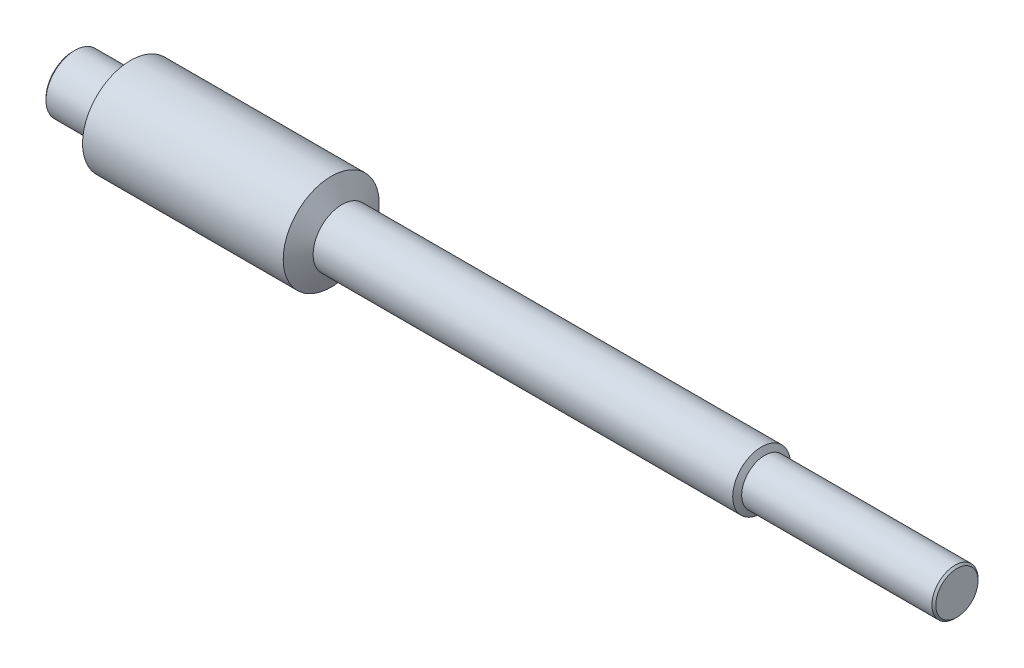
ISO-10303-21;
HEADER;
FILE_DESCRIPTION(('STEP AP214'),'2;1');
FILE_NAME('part.step','',(''),(''),'','','');
FILE_SCHEMA(('AUTOMOTIVE_DESIGN { 1 0 10303 214 1 1 1 1 }'));
ENDSEC;
DATA;
#1=APPLICATION_CONTEXT('core data for automotive mechanical design processes');
#2=APPLICATION_PROTOCOL_DEFINITION('international standard','automotive_design',2000,#1);
#3=PRODUCT_CONTEXT('',#1,'mechanical');
#4=PRODUCT('Part','Part','',(#3));
#5=PRODUCT_RELATED_PRODUCT_CATEGORY('part','',(#4));
#6=PRODUCT_DEFINITION_FORMATION('','',#4);
#7=PRODUCT_DEFINITION_CONTEXT('part definition',#1,'design');
#8=PRODUCT_DEFINITION('design','',#6,#7);
#9=PRODUCT_DEFINITION_SHAPE('','',#8);
#10=(LENGTH_UNIT() NAMED_UNIT(*) SI_UNIT(.MILLI.,.METRE.));
#11=(NAMED_UNIT(*) PLANE_ANGLE_UNIT() SI_UNIT($,.RADIAN.));
#12=(NAMED_UNIT(*) SI_UNIT($,.STERADIAN.) SOLID_ANGLE_UNIT());
#13=UNCERTAINTY_MEASURE_WITH_UNIT(LENGTH_MEASURE(1.E-05),#10,'distance_accuracy_value','');
#14=(GEOMETRIC_REPRESENTATION_CONTEXT(3) GLOBAL_UNCERTAINTY_ASSIGNED_CONTEXT((#13)) GLOBAL_UNIT_ASSIGNED_CONTEXT((#10,
#11,#12)) REPRESENTATION_CONTEXT('',''));
#15=CARTESIAN_POINT('',(0.,0.,0.));
#16=DIRECTION('',(0.,0.,1.));
#17=DIRECTION('',(1.,0.,0.));
#18=AXIS2_PLACEMENT_3D('',#15,#16,#17);
#19=CARTESIAN_POINT('',(-133.522258266138,0.,0.));
#20=DIRECTION('',(1.,0.,0.));
#21=DIRECTION('',(0.,0.,-1.));
#22=AXIS2_PLACEMENT_3D('',#19,#20,#21);
#23=PLANE('',#22);
#24=CARTESIAN_POINT('',(-133.522258266138,0.,0.));
#25=DIRECTION('',(1.,0.,0.));
#26=DIRECTION('',(0.,0.,-1.));
#27=AXIS2_PLACEMENT_3D('',#24,#25,#26);
#28=CIRCLE('',#27,14.);
#29=CARTESIAN_POINT('',(-133.522258266138,0.,-14.));
#30=VERTEX_POINT('',#29);
#31=EDGE_CURVE('E84',#30,#30,#28,.F.);
#32=ORIENTED_EDGE('',*,*,#31,.T.);
#33=EDGE_LOOP('',(#32));
#34=FACE_BOUND('',#33,.T.);
#35=CARTESIAN_POINT('',(-133.522258266138,0.,0.));
#36=DIRECTION('',(-1.,0.,0.));
#37=DIRECTION('',(0.,0.,1.));
#38=AXIS2_PLACEMENT_3D('',#35,#36,#37);
#39=CIRCLE('',#38,3.4);
#40=CARTESIAN_POINT('',(-133.522258266138,0.,3.4));
#41=VERTEX_POINT('',#40);
#42=EDGE_CURVE('E56',#41,#41,#39,.T.);
#43=ORIENTED_EDGE('',*,*,#42,.F.);
#44=EDGE_LOOP('',(#43));
#45=FACE_BOUND('',#44,.T.);
#46=ADVANCED_FACE('F35',(#34,#45),#23,.F.);
#47=CARTESIAN_POINT('',(-73.1788372135069,0.,0.));
#48=DIRECTION('',(-1.,0.,0.));
#49=DIRECTION('',(0.,0.,1.));
#50=AXIS2_PLACEMENT_3D('',#47,#48,#49);
#51=CYLINDRICAL_SURFACE('',#50,15.);
#52=CARTESIAN_POINT('',(-132.522258266138,0.,0.));
#53=DIRECTION('',(1.,0.,0.));
#54=DIRECTION('',(0.,0.,-1.));
#55=AXIS2_PLACEMENT_3D('',#52,#53,#54);
#56=CIRCLE('',#55,15.);
#57=CARTESIAN_POINT('',(-132.522258266138,0.,-15.));
#58=VERTEX_POINT('',#57);
#59=EDGE_CURVE('E87',#58,#58,#56,.T.);
#60=ORIENTED_EDGE('',*,*,#59,.T.);
#61=EDGE_LOOP('',(#60));
#62=FACE_BOUND('',#61,.T.);
#63=CARTESIAN_POINT('',(-106.522258266138,0.,0.));
#64=DIRECTION('',(-1.,0.,0.));
#65=DIRECTION('',(0.,0.,1.));
#66=AXIS2_PLACEMENT_3D('',#63,#64,#65);
#67=CIRCLE('',#66,15.);
#68=CARTESIAN_POINT('',(-106.522258266138,0.,15.));
#69=VERTEX_POINT('',#68);
#70=EDGE_CURVE('E81',#69,#69,#67,.T.);
#71=ORIENTED_EDGE('',*,*,#70,.T.);
#72=EDGE_LOOP('',(#71));
#73=FACE_BOUND('',#72,.T.);
#74=ADVANCED_FACE('F104',(#62,#73),#51,.T.);
#75=CARTESIAN_POINT('',(-106.522258266138,15.,0.));
#76=DIRECTION('',(-1.,0.,0.));
#77=DIRECTION('',(0.,0.,1.));
#78=AXIS2_PLACEMENT_3D('',#75,#76,#77);
#79=PLANE('',#78);
#80=ORIENTED_EDGE('',*,*,#70,.F.);
#81=EDGE_LOOP('',(#80));
#82=FACE_BOUND('',#81,.T.);
#83=CARTESIAN_POINT('',(-106.522258266138,0.,0.));
#84=DIRECTION('',(-1.,0.,0.));
#85=DIRECTION('',(0.,0.,1.));
#86=AXIS2_PLACEMENT_3D('',#83,#84,#85);
#87=CIRCLE('',#86,14.);
#88=CARTESIAN_POINT('',(-106.522258266138,0.,14.));
#89=VERTEX_POINT('',#88);
#90=EDGE_CURVE('E78',#89,#89,#87,.T.);
#91=ORIENTED_EDGE('',*,*,#90,.T.);
#92=EDGE_LOOP('',(#91));
#93=FACE_BOUND('',#92,.T.);
#94=ADVANCED_FACE('F110',(#82,#93),#79,.F.);
#95=CARTESIAN_POINT('',(-73.1788372135069,0.,0.));
#96=DIRECTION('',(-1.,0.,0.));
#97=DIRECTION('',(0.,0.,1.));
#98=AXIS2_PLACEMENT_3D('',#95,#96,#97);
#99=CYLINDRICAL_SURFACE('',#98,14.);
#100=ORIENTED_EDGE('',*,*,#90,.F.);
#101=EDGE_LOOP('',(#100));
#102=FACE_BOUND('',#101,.T.);
#103=CARTESIAN_POINT('',(-103.522258266138,0.,0.));
#104=DIRECTION('',(-1.,0.,0.));
#105=DIRECTION('',(0.,0.,1.));
#106=AXIS2_PLACEMENT_3D('',#103,#104,#105);
#107=CIRCLE('',#106,14.);
#108=CARTESIAN_POINT('',(-103.522258266138,0.,14.));
#109=VERTEX_POINT('',#108);
#110=EDGE_CURVE('E75',#109,#109,#107,.T.);
#111=ORIENTED_EDGE('',*,*,#110,.T.);
#112=EDGE_LOOP('',(#111));
#113=FACE_BOUND('',#112,.T.);
#114=ADVANCED_FACE('F117',(#102,#113),#99,.T.);
#115=CARTESIAN_POINT('',(-103.522258266138,14.,0.));
#116=DIRECTION('',(1.,0.,0.));
#117=DIRECTION('',(0.,0.,-1.));
#118=AXIS2_PLACEMENT_3D('',#115,#116,#117);
#119=PLANE('',#118);
#120=ORIENTED_EDGE('',*,*,#110,.F.);
#121=EDGE_LOOP('',(#120));
#122=FACE_BOUND('',#121,.T.);
#123=CARTESIAN_POINT('',(-103.522258266138,0.,0.));
#124=DIRECTION('',(-1.,0.,0.));
#125=DIRECTION('',(0.,0.,1.));
#126=AXIS2_PLACEMENT_3D('',#123,#124,#125);
#127=CIRCLE('',#126,25.);
#128=CARTESIAN_POINT('',(-103.522258266138,0.,25.));
#129=VERTEX_POINT('',#128);
#130=EDGE_CURVE('E72',#129,#129,#127,.T.);
#131=ORIENTED_EDGE('',*,*,#130,.T.);
#132=EDGE_LOOP('',(#131));
#133=FACE_BOUND('',#132,.T.);
#134=ADVANCED_FACE('F121',(#122,#133),#119,.F.);
#135=CARTESIAN_POINT('',(-73.1788372135069,0.,0.));
#136=DIRECTION('',(-1.,0.,0.));
#137=DIRECTION('',(0.,0.,1.));
#138=AXIS2_PLACEMENT_3D('',#135,#136,#137);
#139=CYLINDRICAL_SURFACE('',#138,25.);
#140=ORIENTED_EDGE('',*,*,#130,.F.);
#141=EDGE_LOOP('',(#140));
#142=FACE_BOUND('',#141,.T.);
#143=CARTESIAN_POINT('',(0.919675372305515,0.,0.));
#144=DIRECTION('',(-1.,0.,0.));
#145=DIRECTION('',(0.,0.,1.));
#146=AXIS2_PLACEMENT_3D('',#143,#144,#145);
#147=CIRCLE('',#146,25.);
#148=CARTESIAN_POINT('',(0.919675372305515,0.,25.));
#149=VERTEX_POINT('',#148);
#150=EDGE_CURVE('E69',#149,#149,#147,.T.);
#151=ORIENTED_EDGE('',*,*,#150,.T.);
#152=EDGE_LOOP('',(#151));
#153=FACE_BOUND('',#152,.T.);
#154=ADVANCED_FACE('F125',(#142,#153),#139,.T.);
#155=CARTESIAN_POINT('',(6.47774173386165,0.,0.));
#156=DIRECTION('',(-1.,0.,0.));
#157=DIRECTION('',(0.,0.,1.));
#158=AXIS2_PLACEMENT_3D('',#155,#156,#157);
#159=CONICAL_SURFACE('',#158,15.,1.06350597937622);
#160=ORIENTED_EDGE('',*,*,#150,.F.);
#161=EDGE_LOOP('',(#160));
#162=FACE_BOUND('',#161,.T.);
#163=CARTESIAN_POINT('',(6.47774173386165,0.,0.));
#164=DIRECTION('',(-1.,0.,0.));
#165=DIRECTION('',(0.,0.,1.));
#166=AXIS2_PLACEMENT_3D('',#163,#164,#165);
#167=CIRCLE('',#166,15.);
#168=CARTESIAN_POINT('',(6.47774173386165,0.,15.));
#169=VERTEX_POINT('',#168);
#170=EDGE_CURVE('E66',#169,#169,#167,.T.);
#171=ORIENTED_EDGE('',*,*,#170,.T.);
#172=EDGE_LOOP('',(#171));
#173=FACE_BOUND('',#172,.T.);
#174=ADVANCED_FACE('F129',(#162,#173),#159,.T.);
#175=CARTESIAN_POINT('',(-73.1788372135069,0.,0.));
#176=DIRECTION('',(-1.,0.,0.));
#177=DIRECTION('',(0.,0.,1.));
#178=AXIS2_PLACEMENT_3D('',#175,#176,#177);
#179=CYLINDRICAL_SURFACE('',#178,15.);
#180=ORIENTED_EDGE('',*,*,#170,.F.);
#181=EDGE_LOOP('',(#180));
#182=FACE_BOUND('',#181,.T.);
#183=CARTESIAN_POINT('',(224.810321825395,0.,0.));
#184=DIRECTION('',(-1.,0.,0.));
#185=DIRECTION('',(0.,0.,1.));
#186=AXIS2_PLACEMENT_3D('',#183,#184,#185);
#187=CIRCLE('',#186,15.);
#188=CARTESIAN_POINT('',(224.810321825395,0.,15.));
#189=VERTEX_POINT('',#188);
#190=EDGE_CURVE('E59',#189,#189,#187,.T.);
#191=ORIENTED_EDGE('',*,*,#190,.T.);
#192=EDGE_LOOP('',(#191));
#193=FACE_BOUND('',#192,.T.);
#194=ADVANCED_FACE('F133',(#182,#193),#179,.T.);
#195=CARTESIAN_POINT('',(226.477741733862,0.,0.));
#196=DIRECTION('',(-1.,0.,0.));
#197=DIRECTION('',(0.,0.,1.));
#198=AXIS2_PLACEMENT_3D('',#195,#196,#197);
#199=CONICAL_SURFACE('',#198,12.,1.06350597937623);
#200=ORIENTED_EDGE('',*,*,#190,.F.);
#201=EDGE_LOOP('',(#200));
#202=FACE_BOUND('',#201,.T.);
#203=CARTESIAN_POINT('',(226.477741733862,0.,0.));
#204=DIRECTION('',(-1.,0.,0.));
#205=DIRECTION('',(0.,0.,1.));
#206=AXIS2_PLACEMENT_3D('',#203,#204,#205);
#207=CIRCLE('',#206,12.);
#208=CARTESIAN_POINT('',(226.477741733862,0.,12.));
#209=VERTEX_POINT('',#208);
#210=EDGE_CURVE('E55',#209,#209,#207,.T.);
#211=ORIENTED_EDGE('',*,*,#210,.T.);
#212=EDGE_LOOP('',(#211));
#213=FACE_BOUND('',#212,.T.);
#214=ADVANCED_FACE('F137',(#202,#213),#199,.T.);
#215=CARTESIAN_POINT('',(-73.1788372135069,0.,0.));
#216=DIRECTION('',(-1.,0.,0.));
#217=DIRECTION('',(0.,0.,1.));
#218=AXIS2_PLACEMENT_3D('',#215,#216,#217);
#219=CYLINDRICAL_SURFACE('',#218,12.);
#220=CARTESIAN_POINT('',(325.477741733862,0.,0.));
#221=DIRECTION('',(-1.,0.,0.));
#222=DIRECTION('',(0.,0.,1.));
#223=AXIS2_PLACEMENT_3D('',#220,#221,#222);
#224=CIRCLE('',#223,12.);
#225=CARTESIAN_POINT('',(325.477741733862,0.,12.));
#226=VERTEX_POINT('',#225);
#227=EDGE_CURVE('E42',#226,#226,#224,.T.);
#228=ORIENTED_EDGE('',*,*,#227,.T.);
#229=EDGE_LOOP('',(#228));
#230=FACE_BOUND('',#229,.T.);
#231=ORIENTED_EDGE('',*,*,#210,.F.);
#232=EDGE_LOOP('',(#231));
#233=FACE_BOUND('',#232,.T.);
#234=ADVANCED_FACE('F92',(#230,#233),#219,.T.);
#235=CARTESIAN_POINT('',(326.477741733862,12.,0.));
#236=DIRECTION('',(-1.,0.,0.));
#237=DIRECTION('',(0.,0.,1.));
#238=AXIS2_PLACEMENT_3D('',#235,#236,#237);
#239=PLANE('',#238);
#240=CARTESIAN_POINT('',(326.477741733862,0.,0.));
#241=DIRECTION('',(-1.,0.,0.));
#242=DIRECTION('',(0.,0.,1.));
#243=AXIS2_PLACEMENT_3D('',#240,#241,#242);
#244=CIRCLE('',#243,11.0000000000002);
#245=CARTESIAN_POINT('',(326.477741733862,0.,11.0000000000002));
#246=VERTEX_POINT('',#245);
#247=EDGE_CURVE('E11',#246,#246,#244,.F.);
#248=ORIENTED_EDGE('',*,*,#247,.T.);
#249=EDGE_LOOP('',(#248));
#250=FACE_BOUND('',#249,.T.);
#251=ADVANCED_FACE('F49',(#250),#239,.F.);
#252=CARTESIAN_POINT('',(-121.272258266138,0.,0.));
#253=DIRECTION('',(-1.,0.,0.));
#254=DIRECTION('',(0.,0.,1.));
#255=AXIS2_PLACEMENT_3D('',#252,#253,#254);
#256=CONICAL_SURFACE('',#255,3.4,1.02974425867665);
#257=CARTESIAN_POINT('',(-119.229332161445,0.,0.));
#258=VERTEX_POINT('',#257);
#259=VERTEX_LOOP('',#258);
#260=FACE_BOUND('',#259,.T.);
#261=CARTESIAN_POINT('',(-121.272258266138,0.,0.));
#262=DIRECTION('',(-1.,0.,0.));
#263=DIRECTION('',(0.,0.,1.));
#264=AXIS2_PLACEMENT_3D('',#261,#262,#263);
#265=CIRCLE('',#264,3.4);
#266=CARTESIAN_POINT('',(-121.272258266138,0.,3.4));
#267=VERTEX_POINT('',#266);
#268=EDGE_CURVE('E53',#267,#267,#265,.T.);
#269=ORIENTED_EDGE('',*,*,#268,.T.);
#270=EDGE_LOOP('',(#269));
#271=FACE_BOUND('',#270,.T.);
#272=ADVANCED_FACE('F45',(#260,#271),#256,.F.);
#273=CARTESIAN_POINT('',(-133.522258266138,0.,0.));
#274=DIRECTION('',(-1.,0.,0.));
#275=DIRECTION('',(0.,0.,1.));
#276=AXIS2_PLACEMENT_3D('',#273,#274,#275);
#277=CYLINDRICAL_SURFACE('',#276,3.4);
#278=ORIENTED_EDGE('',*,*,#268,.F.);
#279=EDGE_LOOP('',(#278));
#280=FACE_BOUND('',#279,.T.);
#281=ORIENTED_EDGE('',*,*,#42,.T.);
#282=EDGE_LOOP('',(#281));
#283=FACE_BOUND('',#282,.T.);
#284=ADVANCED_FACE('F48',(#280,#283),#277,.F.);
#285=CARTESIAN_POINT('',(-133.522258266138,0.,0.));
#286=DIRECTION('',(1.,0.,0.));
#287=DIRECTION('',(0.,0.,-1.));
#288=AXIS2_PLACEMENT_3D('',#285,#286,#287);
#289=CONICAL_SURFACE('',#288,14.,0.785398163397456);
#290=ORIENTED_EDGE('',*,*,#59,.F.);
#291=EDGE_LOOP('',(#290));
#292=FACE_BOUND('',#291,.T.);
#293=ORIENTED_EDGE('',*,*,#31,.F.);
#294=EDGE_LOOP('',(#293));
#295=FACE_BOUND('',#294,.T.);
#296=ADVANCED_FACE('F96',(#292,#295),#289,.T.);
#297=CARTESIAN_POINT('',(325.477741733862,0.,0.));
#298=DIRECTION('',(-1.,0.,0.));
#299=DIRECTION('',(0.,0.,1.));
#300=AXIS2_PLACEMENT_3D('',#297,#298,#299);
#301=CONICAL_SURFACE('',#300,12.,0.785398163397416);
#302=ORIENTED_EDGE('',*,*,#247,.F.);
#303=EDGE_LOOP('',(#302));
#304=FACE_BOUND('',#303,.T.);
#305=ORIENTED_EDGE('',*,*,#227,.F.);
#306=EDGE_LOOP('',(#305));
#307=FACE_BOUND('',#306,.T.);
#308=ADVANCED_FACE('F37',(#304,#307),#301,.T.);
#309=CLOSED_SHELL('',(#46,#74,#94,#114,#134,#154,#174,#194,#214,#234,#251,#272,#284,#296,#308));
#310=MANIFOLD_SOLID_BREP('B2',#309);
#311=ADVANCED_BREP_SHAPE_REPRESENTATION('',(#18,#310),#14);
#312=SHAPE_DEFINITION_REPRESENTATION(#9,#311);
ENDSEC;
END-ISO-10303-21;
